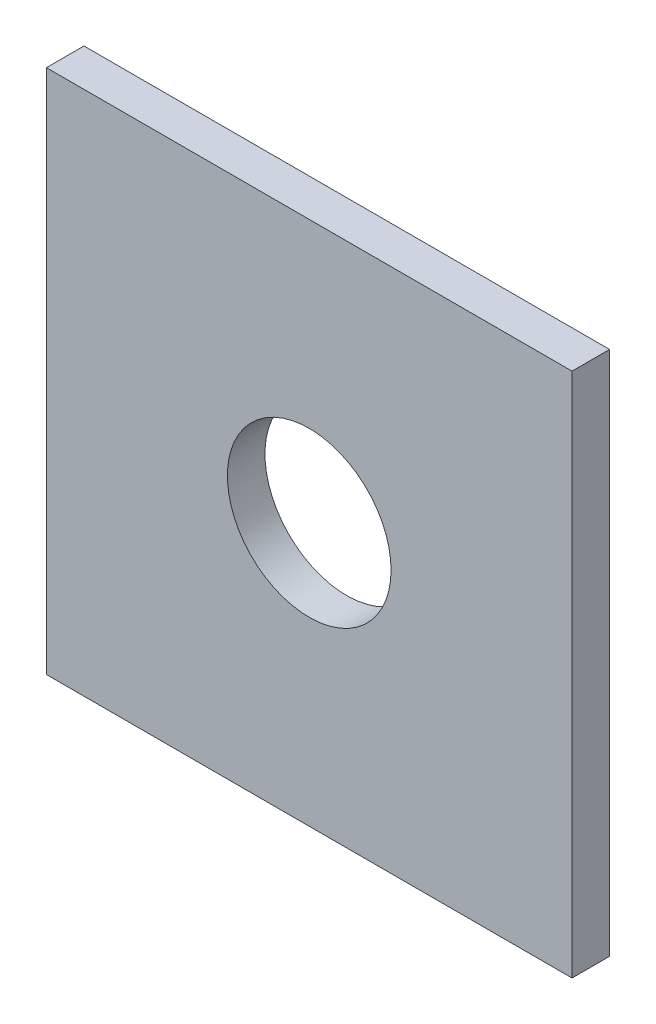
ISO-10303-21;
HEADER;
FILE_DESCRIPTION(('STEP AP214'),'2;1');
FILE_NAME('part.step','',(''),(''),'','','');
FILE_SCHEMA(('AUTOMOTIVE_DESIGN { 1 0 10303 214 1 1 1 1 }'));
ENDSEC;
DATA;
#1=APPLICATION_CONTEXT('core data for automotive mechanical design processes');
#2=APPLICATION_PROTOCOL_DEFINITION('international standard','automotive_design',2000,#1);
#3=PRODUCT_CONTEXT('',#1,'mechanical');
#4=PRODUCT('Part','Part','',(#3));
#5=PRODUCT_RELATED_PRODUCT_CATEGORY('part','',(#4));
#6=PRODUCT_DEFINITION_FORMATION('','',#4);
#7=PRODUCT_DEFINITION_CONTEXT('part definition',#1,'design');
#8=PRODUCT_DEFINITION('design','',#6,#7);
#9=PRODUCT_DEFINITION_SHAPE('','',#8);
#10=(LENGTH_UNIT() NAMED_UNIT(*) SI_UNIT(.MILLI.,.METRE.));
#11=(NAMED_UNIT(*) PLANE_ANGLE_UNIT() SI_UNIT($,.RADIAN.));
#12=(NAMED_UNIT(*) SI_UNIT($,.STERADIAN.) SOLID_ANGLE_UNIT());
#13=UNCERTAINTY_MEASURE_WITH_UNIT(LENGTH_MEASURE(1.E-05),#10,'distance_accuracy_value','');
#14=(GEOMETRIC_REPRESENTATION_CONTEXT(3) GLOBAL_UNCERTAINTY_ASSIGNED_CONTEXT((#13)) GLOBAL_UNIT_ASSIGNED_CONTEXT((#10,
#11,#12)) REPRESENTATION_CONTEXT('',''));
#15=CARTESIAN_POINT('',(0.,0.,0.));
#16=DIRECTION('',(0.,0.,1.));
#17=DIRECTION('',(1.,0.,0.));
#18=AXIS2_PLACEMENT_3D('',#15,#16,#17);
#19=CARTESIAN_POINT('',(0.,0.,5.));
#20=DIRECTION('',(0.,0.,-1.));
#21=DIRECTION('',(-1.,0.,0.));
#22=AXIS2_PLACEMENT_3D('',#19,#20,#21);
#23=PLANE('',#22);
#24=DIRECTION('',(0.,-1.,0.));
#25=VECTOR('',#24,1.);
#26=CARTESIAN_POINT('',(-35.,0.,5.));
#27=LINE('',#26,#25);
#28=CARTESIAN_POINT('',(-35.,70.,5.));
#29=VERTEX_POINT('',#28);
#30=CARTESIAN_POINT('',(-35.,0.,5.));
#31=VERTEX_POINT('',#30);
#32=EDGE_CURVE('E92',#29,#31,#27,.T.);
#33=ORIENTED_EDGE('',*,*,#32,.T.);
#34=DIRECTION('',(1.,0.,0.));
#35=VECTOR('',#34,1.);
#36=CARTESIAN_POINT('',(-35.,0.,5.));
#37=LINE('',#36,#35);
#38=CARTESIAN_POINT('',(35.,0.,5.));
#39=VERTEX_POINT('',#38);
#40=EDGE_CURVE('E87',#31,#39,#37,.T.);
#41=ORIENTED_EDGE('',*,*,#40,.T.);
#42=DIRECTION('',(0.,1.,0.));
#43=VECTOR('',#42,1.);
#44=CARTESIAN_POINT('',(35.,0.,5.));
#45=LINE('',#44,#43);
#46=CARTESIAN_POINT('',(35.,70.,5.));
#47=VERTEX_POINT('',#46);
#48=EDGE_CURVE('E90',#39,#47,#45,.T.);
#49=ORIENTED_EDGE('',*,*,#48,.T.);
#50=DIRECTION('',(-1.,0.,0.));
#51=VECTOR('',#50,1.);
#52=CARTESIAN_POINT('',(-35.,70.,5.));
#53=LINE('',#52,#51);
#54=EDGE_CURVE('E57',#47,#29,#53,.T.);
#55=ORIENTED_EDGE('',*,*,#54,.T.);
#56=EDGE_LOOP('',(#33,#41,#49,#55));
#57=FACE_BOUND('',#56,.T.);
#58=CARTESIAN_POINT('',(0.,35.,5.));
#59=DIRECTION('',(0.,0.,1.));
#60=DIRECTION('',(1.,0.,0.));
#61=AXIS2_PLACEMENT_3D('',#58,#59,#60);
#62=CIRCLE('',#61,10.9);
#63=CARTESIAN_POINT('',(10.9,35.,5.));
#64=VERTEX_POINT('',#63);
#65=EDGE_CURVE('E112',#64,#64,#62,.T.);
#66=ORIENTED_EDGE('',*,*,#65,.F.);
#67=EDGE_LOOP('',(#66));
#68=FACE_BOUND('',#67,.T.);
#69=ADVANCED_FACE('F39',(#57,#68),#23,.F.);
#70=CARTESIAN_POINT('',(0.,0.,0.));
#71=DIRECTION('',(0.,0.,-1.));
#72=DIRECTION('',(-1.,0.,0.));
#73=AXIS2_PLACEMENT_3D('',#70,#71,#72);
#74=PLANE('',#73);
#75=DIRECTION('',(0.,-1.,0.));
#76=VECTOR('',#75,1.);
#77=CARTESIAN_POINT('',(-35.,0.,0.));
#78=LINE('',#77,#76);
#79=CARTESIAN_POINT('',(-35.,70.,0.));
#80=VERTEX_POINT('',#79);
#81=CARTESIAN_POINT('',(-35.,0.,0.));
#82=VERTEX_POINT('',#81);
#83=EDGE_CURVE('E108',#80,#82,#78,.T.);
#84=ORIENTED_EDGE('',*,*,#83,.F.);
#85=DIRECTION('',(-1.,0.,0.));
#86=VECTOR('',#85,1.);
#87=CARTESIAN_POINT('',(-35.,70.,0.));
#88=LINE('',#87,#86);
#89=CARTESIAN_POINT('',(35.,70.,0.));
#90=VERTEX_POINT('',#89);
#91=EDGE_CURVE('E80',#90,#80,#88,.T.);
#92=ORIENTED_EDGE('',*,*,#91,.F.);
#93=DIRECTION('',(0.,1.,0.));
#94=VECTOR('',#93,1.);
#95=CARTESIAN_POINT('',(35.,0.,0.));
#96=LINE('',#95,#94);
#97=CARTESIAN_POINT('',(35.,0.,0.));
#98=VERTEX_POINT('',#97);
#99=EDGE_CURVE('E74',#98,#90,#96,.T.);
#100=ORIENTED_EDGE('',*,*,#99,.F.);
#101=DIRECTION('',(1.,0.,0.));
#102=VECTOR('',#101,1.);
#103=CARTESIAN_POINT('',(-35.,0.,0.));
#104=LINE('',#103,#102);
#105=EDGE_CURVE('E97',#82,#98,#104,.T.);
#106=ORIENTED_EDGE('',*,*,#105,.F.);
#107=EDGE_LOOP('',(#84,#92,#100,#106));
#108=FACE_BOUND('',#107,.T.);
#109=CARTESIAN_POINT('',(0.,35.,0.));
#110=DIRECTION('',(0.,0.,1.));
#111=DIRECTION('',(1.,0.,0.));
#112=AXIS2_PLACEMENT_3D('',#109,#110,#111);
#113=CIRCLE('',#112,10.9);
#114=CARTESIAN_POINT('',(10.9,35.,0.));
#115=VERTEX_POINT('',#114);
#116=EDGE_CURVE('E130',#115,#115,#113,.T.);
#117=ORIENTED_EDGE('',*,*,#116,.T.);
#118=EDGE_LOOP('',(#117));
#119=FACE_BOUND('',#118,.T.);
#120=ADVANCED_FACE('F125',(#108,#119),#74,.T.);
#121=CARTESIAN_POINT('',(-35.,0.,5.));
#122=DIRECTION('',(1.,0.,0.));
#123=DIRECTION('',(0.,1.,0.));
#124=AXIS2_PLACEMENT_3D('',#121,#122,#123);
#125=PLANE('',#124);
#126=ORIENTED_EDGE('',*,*,#83,.T.);
#127=DIRECTION('',(0.,0.,-1.));
#128=VECTOR('',#127,1.);
#129=CARTESIAN_POINT('',(-35.,0.,5.));
#130=LINE('',#129,#128);
#131=EDGE_CURVE('E11',#31,#82,#130,.T.);
#132=ORIENTED_EDGE('',*,*,#131,.F.);
#133=ORIENTED_EDGE('',*,*,#32,.F.);
#134=DIRECTION('',(0.,0.,-1.));
#135=VECTOR('',#134,1.);
#136=CARTESIAN_POINT('',(-35.,70.,5.));
#137=LINE('',#136,#135);
#138=EDGE_CURVE('E104',#29,#80,#137,.T.);
#139=ORIENTED_EDGE('',*,*,#138,.T.);
#140=EDGE_LOOP('',(#126,#132,#133,#139));
#141=FACE_BOUND('',#140,.T.);
#142=ADVANCED_FACE('F41',(#141),#125,.F.);
#143=CARTESIAN_POINT('',(-35.,0.,5.));
#144=DIRECTION('',(0.,1.,0.));
#145=DIRECTION('',(-1.,0.,0.));
#146=AXIS2_PLACEMENT_3D('',#143,#144,#145);
#147=PLANE('',#146);
#148=ORIENTED_EDGE('',*,*,#105,.T.);
#149=DIRECTION('',(0.,0.,-1.));
#150=VECTOR('',#149,1.);
#151=CARTESIAN_POINT('',(35.,0.,5.));
#152=LINE('',#151,#150);
#153=EDGE_CURVE('E49',#39,#98,#152,.T.);
#154=ORIENTED_EDGE('',*,*,#153,.F.);
#155=ORIENTED_EDGE('',*,*,#40,.F.);
#156=ORIENTED_EDGE('',*,*,#131,.T.);
#157=EDGE_LOOP('',(#148,#154,#155,#156));
#158=FACE_BOUND('',#157,.T.);
#159=ADVANCED_FACE('F96',(#158),#147,.F.);
#160=CARTESIAN_POINT('',(35.,0.,5.));
#161=DIRECTION('',(-1.,0.,0.));
#162=DIRECTION('',(0.,-1.,0.));
#163=AXIS2_PLACEMENT_3D('',#160,#161,#162);
#164=PLANE('',#163);
#165=ORIENTED_EDGE('',*,*,#99,.T.);
#166=DIRECTION('',(0.,0.,-1.));
#167=VECTOR('',#166,1.);
#168=CARTESIAN_POINT('',(35.,70.,5.));
#169=LINE('',#168,#167);
#170=EDGE_CURVE('E99',#47,#90,#169,.T.);
#171=ORIENTED_EDGE('',*,*,#170,.F.);
#172=ORIENTED_EDGE('',*,*,#48,.F.);
#173=ORIENTED_EDGE('',*,*,#153,.T.);
#174=EDGE_LOOP('',(#165,#171,#172,#173));
#175=FACE_BOUND('',#174,.T.);
#176=ADVANCED_FACE('F100',(#175),#164,.F.);
#177=CARTESIAN_POINT('',(-35.,70.,5.));
#178=DIRECTION('',(0.,-1.,0.));
#179=DIRECTION('',(1.,0.,0.));
#180=AXIS2_PLACEMENT_3D('',#177,#178,#179);
#181=PLANE('',#180);
#182=ORIENTED_EDGE('',*,*,#91,.T.);
#183=ORIENTED_EDGE('',*,*,#138,.F.);
#184=ORIENTED_EDGE('',*,*,#54,.F.);
#185=ORIENTED_EDGE('',*,*,#170,.T.);
#186=EDGE_LOOP('',(#182,#183,#184,#185));
#187=FACE_BOUND('',#186,.T.);
#188=ADVANCED_FACE('F122',(#187),#181,.F.);
#189=CARTESIAN_POINT('',(0.,35.,5.));
#190=DIRECTION('',(0.,0.,-1.));
#191=DIRECTION('',(-1.,0.,0.));
#192=AXIS2_PLACEMENT_3D('',#189,#190,#191);
#193=CYLINDRICAL_SURFACE('',#192,10.9);
#194=ORIENTED_EDGE('',*,*,#65,.T.);
#195=EDGE_LOOP('',(#194));
#196=FACE_BOUND('',#195,.T.);
#197=ORIENTED_EDGE('',*,*,#116,.F.);
#198=EDGE_LOOP('',(#197));
#199=FACE_BOUND('',#198,.T.);
#200=ADVANCED_FACE('F138',(#196,#199),#193,.F.);
#201=CLOSED_SHELL('',(#69,#120,#142,#159,#176,#188,#200));
#202=MANIFOLD_SOLID_BREP('B2',#201);
#203=ADVANCED_BREP_SHAPE_REPRESENTATION('',(#18,#202),#14);
#204=SHAPE_DEFINITION_REPRESENTATION(#9,#203);
ENDSEC;
END-ISO-10303-21;
